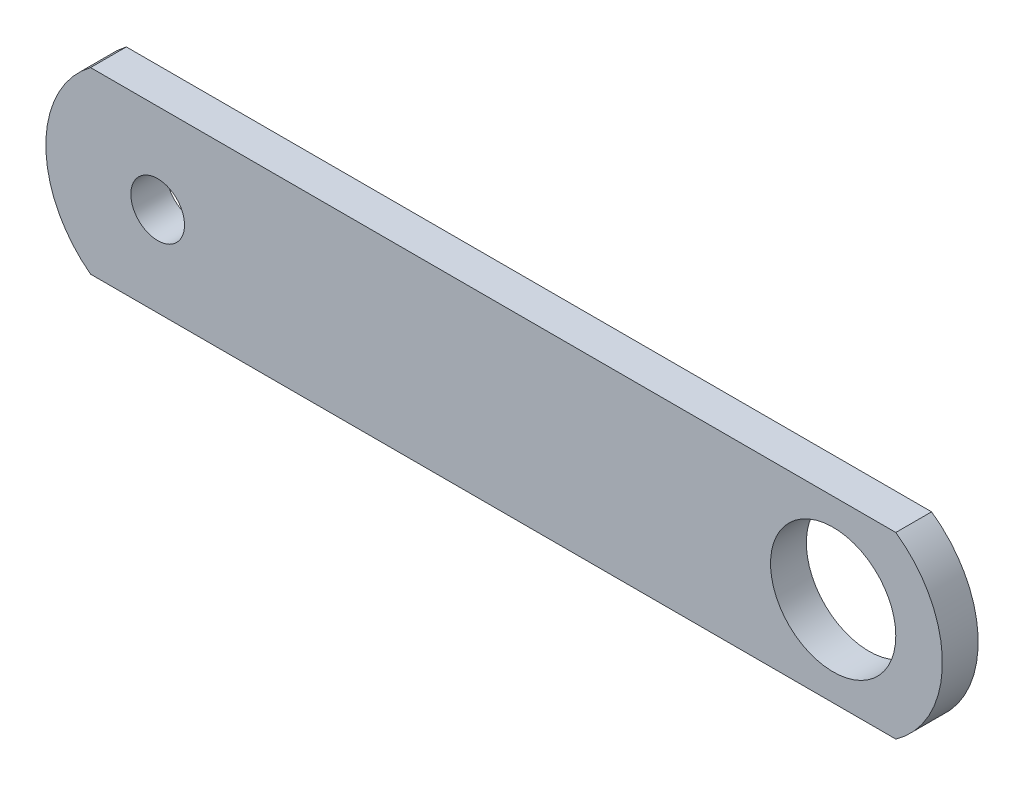
ISO-10303-21;
HEADER;
FILE_DESCRIPTION(('STEP AP214'),'2;1');
FILE_NAME('part.step','',(''),(''),'','','');
FILE_SCHEMA(('AUTOMOTIVE_DESIGN { 1 0 10303 214 1 1 1 1 }'));
ENDSEC;
DATA;
#1=APPLICATION_CONTEXT('core data for automotive mechanical design processes');
#2=APPLICATION_PROTOCOL_DEFINITION('international standard','automotive_design',2000,#1);
#3=PRODUCT_CONTEXT('',#1,'mechanical');
#4=PRODUCT('Part','Part','',(#3));
#5=PRODUCT_RELATED_PRODUCT_CATEGORY('part','',(#4));
#6=PRODUCT_DEFINITION_FORMATION('','',#4);
#7=PRODUCT_DEFINITION_CONTEXT('part definition',#1,'design');
#8=PRODUCT_DEFINITION('design','',#6,#7);
#9=PRODUCT_DEFINITION_SHAPE('','',#8);
#10=(LENGTH_UNIT() NAMED_UNIT(*) SI_UNIT(.MILLI.,.METRE.));
#11=(NAMED_UNIT(*) PLANE_ANGLE_UNIT() SI_UNIT($,.RADIAN.));
#12=(NAMED_UNIT(*) SI_UNIT($,.STERADIAN.) SOLID_ANGLE_UNIT());
#13=UNCERTAINTY_MEASURE_WITH_UNIT(LENGTH_MEASURE(1.E-05),#10,'distance_accuracy_value','');
#14=(GEOMETRIC_REPRESENTATION_CONTEXT(3) GLOBAL_UNCERTAINTY_ASSIGNED_CONTEXT((#13)) GLOBAL_UNIT_ASSIGNED_CONTEXT((#10,
#11,#12)) REPRESENTATION_CONTEXT('',''));
#15=CARTESIAN_POINT('',(0.,0.,0.));
#16=DIRECTION('',(0.,0.,1.));
#17=DIRECTION('',(1.,0.,0.));
#18=AXIS2_PLACEMENT_3D('',#15,#16,#17);
#19=CARTESIAN_POINT('',(38.,0.,4.));
#20=DIRECTION('',(0.,0.,-1.));
#21=DIRECTION('',(-1.,0.,0.));
#22=AXIS2_PLACEMENT_3D('',#19,#20,#21);
#23=PLANE('',#22);
#24=CARTESIAN_POINT('',(38.,0.,4.));
#25=DIRECTION('',(0.,0.,1.));
#26=DIRECTION('',(-1.,0.,0.));
#27=AXIS2_PLACEMENT_3D('',#24,#25,#26);
#28=CIRCLE('',#27,12.2065556157337);
#29=CARTESIAN_POINT('',(45.,-10.,4.));
#30=VERTEX_POINT('',#29);
#31=CARTESIAN_POINT('',(45.,10.,4.));
#32=VERTEX_POINT('',#31);
#33=EDGE_CURVE('E88',#30,#32,#28,.T.);
#34=ORIENTED_EDGE('',*,*,#33,.T.);
#35=DIRECTION('',(-1.,0.,0.));
#36=VECTOR('',#35,1.);
#37=CARTESIAN_POINT('',(-45.,10.,4.));
#38=LINE('',#37,#36);
#39=CARTESIAN_POINT('',(-45.,10.,4.));
#40=VERTEX_POINT('',#39);
#41=EDGE_CURVE('E83',#32,#40,#38,.T.);
#42=ORIENTED_EDGE('',*,*,#41,.T.);
#43=CARTESIAN_POINT('',(-37.5,0.,4.));
#44=DIRECTION('',(0.,0.,1.));
#45=DIRECTION('',(-1.,0.,0.));
#46=AXIS2_PLACEMENT_3D('',#43,#44,#45);
#47=CIRCLE('',#46,12.5);
#48=CARTESIAN_POINT('',(-45.,-10.,4.));
#49=VERTEX_POINT('',#48);
#50=EDGE_CURVE('E86',#40,#49,#47,.T.);
#51=ORIENTED_EDGE('',*,*,#50,.T.);
#52=DIRECTION('',(1.,0.,0.));
#53=VECTOR('',#52,1.);
#54=CARTESIAN_POINT('',(-45.,-10.,4.));
#55=LINE('',#54,#53);
#56=EDGE_CURVE('E53',#49,#30,#55,.T.);
#57=ORIENTED_EDGE('',*,*,#56,.T.);
#58=EDGE_LOOP('',(#34,#42,#51,#57));
#59=FACE_BOUND('',#58,.T.);
#60=CARTESIAN_POINT('',(-37.5,0.,4.));
#61=DIRECTION('',(0.,0.,1.));
#62=DIRECTION('',(1.,0.,0.));
#63=AXIS2_PLACEMENT_3D('',#60,#61,#62);
#64=CIRCLE('',#63,3.);
#65=CARTESIAN_POINT('',(-34.5,0.,4.));
#66=VERTEX_POINT('',#65);
#67=EDGE_CURVE('E103',#66,#66,#64,.T.);
#68=ORIENTED_EDGE('',*,*,#67,.F.);
#69=EDGE_LOOP('',(#68));
#70=FACE_BOUND('',#69,.T.);
#71=CARTESIAN_POINT('',(38.,0.,4.));
#72=DIRECTION('',(0.,0.,1.));
#73=DIRECTION('',(1.,0.,0.));
#74=AXIS2_PLACEMENT_3D('',#71,#72,#73);
#75=CIRCLE('',#74,7.);
#76=CARTESIAN_POINT('',(45.,0.,4.));
#77=VERTEX_POINT('',#76);
#78=EDGE_CURVE('E118',#77,#77,#75,.T.);
#79=ORIENTED_EDGE('',*,*,#78,.F.);
#80=EDGE_LOOP('',(#79));
#81=FACE_BOUND('',#80,.T.);
#82=ADVANCED_FACE('F36',(#59,#70,#81),#23,.F.);
#83=CARTESIAN_POINT('',(38.,0.,0.));
#84=DIRECTION('',(0.,0.,-1.));
#85=DIRECTION('',(-1.,0.,0.));
#86=AXIS2_PLACEMENT_3D('',#83,#84,#85);
#87=PLANE('',#86);
#88=CARTESIAN_POINT('',(-37.5,0.,0.));
#89=DIRECTION('',(0.,0.,1.));
#90=DIRECTION('',(1.,0.,0.));
#91=AXIS2_PLACEMENT_3D('',#88,#89,#90);
#92=CIRCLE('',#91,3.);
#93=CARTESIAN_POINT('',(-34.5,0.,0.));
#94=VERTEX_POINT('',#93);
#95=EDGE_CURVE('E115',#94,#94,#92,.T.);
#96=ORIENTED_EDGE('',*,*,#95,.T.);
#97=EDGE_LOOP('',(#96));
#98=FACE_BOUND('',#97,.T.);
#99=CARTESIAN_POINT('',(38.,0.,0.));
#100=DIRECTION('',(0.,0.,1.));
#101=DIRECTION('',(-1.,0.,0.));
#102=AXIS2_PLACEMENT_3D('',#99,#100,#101);
#103=CIRCLE('',#102,12.2065556157337);
#104=CARTESIAN_POINT('',(45.,-10.,0.));
#105=VERTEX_POINT('',#104);
#106=CARTESIAN_POINT('',(45.,10.,0.));
#107=VERTEX_POINT('',#106);
#108=EDGE_CURVE('E100',#105,#107,#103,.T.);
#109=ORIENTED_EDGE('',*,*,#108,.F.);
#110=DIRECTION('',(1.,0.,0.));
#111=VECTOR('',#110,1.);
#112=CARTESIAN_POINT('',(-45.,-10.,0.));
#113=LINE('',#112,#111);
#114=CARTESIAN_POINT('',(-45.,-10.,0.));
#115=VERTEX_POINT('',#114);
#116=EDGE_CURVE('E76',#115,#105,#113,.T.);
#117=ORIENTED_EDGE('',*,*,#116,.F.);
#118=CARTESIAN_POINT('',(-37.5,0.,0.));
#119=DIRECTION('',(0.,0.,1.));
#120=DIRECTION('',(-1.,0.,0.));
#121=AXIS2_PLACEMENT_3D('',#118,#119,#120);
#122=CIRCLE('',#121,12.5);
#123=CARTESIAN_POINT('',(-45.,10.,0.));
#124=VERTEX_POINT('',#123);
#125=EDGE_CURVE('E70',#124,#115,#122,.T.);
#126=ORIENTED_EDGE('',*,*,#125,.F.);
#127=DIRECTION('',(-1.,0.,0.));
#128=VECTOR('',#127,1.);
#129=CARTESIAN_POINT('',(-45.,10.,0.));
#130=LINE('',#129,#128);
#131=EDGE_CURVE('E92',#107,#124,#130,.T.);
#132=ORIENTED_EDGE('',*,*,#131,.F.);
#133=EDGE_LOOP('',(#109,#117,#126,#132));
#134=FACE_BOUND('',#133,.T.);
#135=CARTESIAN_POINT('',(38.,0.,0.));
#136=DIRECTION('',(0.,0.,1.));
#137=DIRECTION('',(1.,0.,0.));
#138=AXIS2_PLACEMENT_3D('',#135,#136,#137);
#139=CIRCLE('',#138,7.);
#140=CARTESIAN_POINT('',(45.,0.,0.));
#141=VERTEX_POINT('',#140);
#142=EDGE_CURVE('E121',#141,#141,#139,.T.);
#143=ORIENTED_EDGE('',*,*,#142,.T.);
#144=EDGE_LOOP('',(#143));
#145=FACE_BOUND('',#144,.T.);
#146=ADVANCED_FACE('F111',(#98,#134,#145),#87,.T.);
#147=CARTESIAN_POINT('',(38.,0.,4.));
#148=DIRECTION('',(0.,0.,-1.));
#149=DIRECTION('',(-1.,0.,0.));
#150=AXIS2_PLACEMENT_3D('',#147,#148,#149);
#151=CYLINDRICAL_SURFACE('',#150,12.2065556157337);
#152=ORIENTED_EDGE('',*,*,#108,.T.);
#153=DIRECTION('',(0.,0.,-1.));
#154=VECTOR('',#153,1.);
#155=CARTESIAN_POINT('',(45.,10.,4.));
#156=LINE('',#155,#154);
#157=EDGE_CURVE('E11',#32,#107,#156,.T.);
#158=ORIENTED_EDGE('',*,*,#157,.F.);
#159=ORIENTED_EDGE('',*,*,#33,.F.);
#160=DIRECTION('',(0.,0.,-1.));
#161=VECTOR('',#160,1.);
#162=CARTESIAN_POINT('',(45.,-10.,4.));
#163=LINE('',#162,#161);
#164=EDGE_CURVE('E96',#30,#105,#163,.T.);
#165=ORIENTED_EDGE('',*,*,#164,.T.);
#166=EDGE_LOOP('',(#152,#158,#159,#165));
#167=FACE_BOUND('',#166,.T.);
#168=ADVANCED_FACE('F38',(#167),#151,.T.);
#169=CARTESIAN_POINT('',(-45.,10.,4.));
#170=DIRECTION('',(0.,-1.,0.));
#171=DIRECTION('',(0.,0.,-1.));
#172=AXIS2_PLACEMENT_3D('',#169,#170,#171);
#173=PLANE('',#172);
#174=ORIENTED_EDGE('',*,*,#131,.T.);
#175=DIRECTION('',(0.,0.,-1.));
#176=VECTOR('',#175,1.);
#177=CARTESIAN_POINT('',(-45.,10.,4.));
#178=LINE('',#177,#176);
#179=EDGE_CURVE('E45',#40,#124,#178,.T.);
#180=ORIENTED_EDGE('',*,*,#179,.F.);
#181=ORIENTED_EDGE('',*,*,#41,.F.);
#182=ORIENTED_EDGE('',*,*,#157,.T.);
#183=EDGE_LOOP('',(#174,#180,#181,#182));
#184=FACE_BOUND('',#183,.T.);
#185=ADVANCED_FACE('F91',(#184),#173,.F.);
#186=CARTESIAN_POINT('',(-37.5,0.,4.));
#187=DIRECTION('',(0.,0.,-1.));
#188=DIRECTION('',(-1.,0.,0.));
#189=AXIS2_PLACEMENT_3D('',#186,#187,#188);
#190=CYLINDRICAL_SURFACE('',#189,12.5);
#191=ORIENTED_EDGE('',*,*,#125,.T.);
#192=DIRECTION('',(0.,0.,-1.));
#193=VECTOR('',#192,1.);
#194=CARTESIAN_POINT('',(-45.,-10.,4.));
#195=LINE('',#194,#193);
#196=EDGE_CURVE('E93',#49,#115,#195,.T.);
#197=ORIENTED_EDGE('',*,*,#196,.F.);
#198=ORIENTED_EDGE('',*,*,#50,.F.);
#199=ORIENTED_EDGE('',*,*,#179,.T.);
#200=EDGE_LOOP('',(#191,#197,#198,#199));
#201=FACE_BOUND('',#200,.T.);
#202=ADVANCED_FACE('F94',(#201),#190,.T.);
#203=CARTESIAN_POINT('',(-45.,-10.,4.));
#204=DIRECTION('',(0.,1.,0.));
#205=DIRECTION('',(0.,0.,1.));
#206=AXIS2_PLACEMENT_3D('',#203,#204,#205);
#207=PLANE('',#206);
#208=ORIENTED_EDGE('',*,*,#116,.T.);
#209=ORIENTED_EDGE('',*,*,#164,.F.);
#210=ORIENTED_EDGE('',*,*,#56,.F.);
#211=ORIENTED_EDGE('',*,*,#196,.T.);
#212=EDGE_LOOP('',(#208,#209,#210,#211));
#213=FACE_BOUND('',#212,.T.);
#214=ADVANCED_FACE('F108',(#213),#207,.F.);
#215=CARTESIAN_POINT('',(-37.5,0.,4.));
#216=DIRECTION('',(0.,0.,-1.));
#217=DIRECTION('',(-1.,0.,0.));
#218=AXIS2_PLACEMENT_3D('',#215,#216,#217);
#219=CYLINDRICAL_SURFACE('',#218,3.);
#220=ORIENTED_EDGE('',*,*,#67,.T.);
#221=EDGE_LOOP('',(#220));
#222=FACE_BOUND('',#221,.T.);
#223=ORIENTED_EDGE('',*,*,#95,.F.);
#224=EDGE_LOOP('',(#223));
#225=FACE_BOUND('',#224,.T.);
#226=ADVANCED_FACE('F138',(#222,#225),#219,.F.);
#227=CARTESIAN_POINT('',(38.,0.,4.));
#228=DIRECTION('',(0.,0.,-1.));
#229=DIRECTION('',(-1.,0.,0.));
#230=AXIS2_PLACEMENT_3D('',#227,#228,#229);
#231=CYLINDRICAL_SURFACE('',#230,7.);
#232=ORIENTED_EDGE('',*,*,#78,.T.);
#233=EDGE_LOOP('',(#232));
#234=FACE_BOUND('',#233,.T.);
#235=ORIENTED_EDGE('',*,*,#142,.F.);
#236=EDGE_LOOP('',(#235));
#237=FACE_BOUND('',#236,.T.);
#238=ADVANCED_FACE('F127',(#234,#237),#231,.F.);
#239=CLOSED_SHELL('',(#82,#146,#168,#185,#202,#214,#226,#238));
#240=MANIFOLD_SOLID_BREP('B2',#239);
#241=ADVANCED_BREP_SHAPE_REPRESENTATION('',(#18,#240),#14);
#242=SHAPE_DEFINITION_REPRESENTATION(#9,#241);
ENDSEC;
END-ISO-10303-21;
